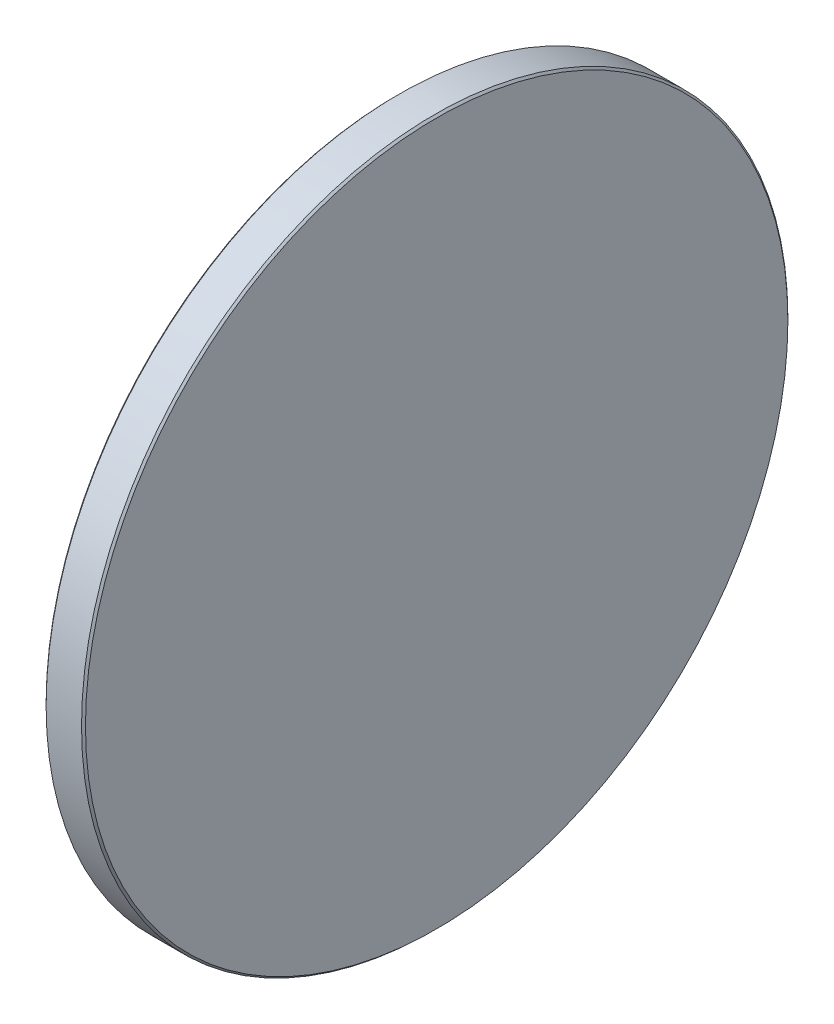
ISO-10303-21;
HEADER;
FILE_DESCRIPTION(('STEP AP214'),'2;1');
FILE_NAME('part.step','',(''),(''),'','','');
FILE_SCHEMA(('AUTOMOTIVE_DESIGN { 1 0 10303 214 1 1 1 1 }'));
ENDSEC;
DATA;
#1=APPLICATION_CONTEXT('core data for automotive mechanical design processes');
#2=APPLICATION_PROTOCOL_DEFINITION('international standard','automotive_design',2000,#1);
#3=PRODUCT_CONTEXT('',#1,'mechanical');
#4=PRODUCT('Part','Part','',(#3));
#5=PRODUCT_RELATED_PRODUCT_CATEGORY('part','',(#4));
#6=PRODUCT_DEFINITION_FORMATION('','',#4);
#7=PRODUCT_DEFINITION_CONTEXT('part definition',#1,'design');
#8=PRODUCT_DEFINITION('design','',#6,#7);
#9=PRODUCT_DEFINITION_SHAPE('','',#8);
#10=(LENGTH_UNIT() NAMED_UNIT(*) SI_UNIT(.MILLI.,.METRE.));
#11=(NAMED_UNIT(*) PLANE_ANGLE_UNIT() SI_UNIT($,.RADIAN.));
#12=(NAMED_UNIT(*) SI_UNIT($,.STERADIAN.) SOLID_ANGLE_UNIT());
#13=UNCERTAINTY_MEASURE_WITH_UNIT(LENGTH_MEASURE(1.E-05),#10,'distance_accuracy_value','');
#14=(GEOMETRIC_REPRESENTATION_CONTEXT(3) GLOBAL_UNCERTAINTY_ASSIGNED_CONTEXT((#13)) GLOBAL_UNIT_ASSIGNED_CONTEXT((#10,
#11,#12)) REPRESENTATION_CONTEXT('',''));
#15=CARTESIAN_POINT('',(0.,0.,0.));
#16=DIRECTION('',(0.,0.,1.));
#17=DIRECTION('',(1.,0.,0.));
#18=AXIS2_PLACEMENT_3D('',#15,#16,#17);
#19=CARTESIAN_POINT('',(-1.415,0.,0.));
#20=DIRECTION('',(1.,0.,0.));
#21=DIRECTION('',(0.,0.,-1.));
#22=AXIS2_PLACEMENT_3D('',#19,#20,#21);
#23=PLANE('',#22);
#24=CARTESIAN_POINT('',(-1.415,0.,0.));
#25=DIRECTION('',(-1.,0.,0.));
#26=DIRECTION('',(0.,0.,1.));
#27=AXIS2_PLACEMENT_3D('',#24,#25,#26);
#28=CIRCLE('',#27,25.2585786437627);
#29=CARTESIAN_POINT('',(-1.415,0.,25.2585786437627));
#30=VERTEX_POINT('',#29);
#31=EDGE_CURVE('E9',#30,#30,#28,.T.);
#32=ORIENTED_EDGE('',*,*,#31,.T.);
#33=EDGE_LOOP('',(#32));
#34=FACE_BOUND('',#33,.T.);
#35=ADVANCED_FACE('F13',(#34),#23,.F.);
#36=CARTESIAN_POINT('',(-1.27357864376269,0.,0.));
#37=DIRECTION('',(1.,0.,0.));
#38=DIRECTION('',(0.,0.,-1.));
#39=AXIS2_PLACEMENT_3D('',#36,#37,#38);
#40=CONICAL_SURFACE('',#39,25.4,0.785398163397451);
#41=ORIENTED_EDGE('',*,*,#31,.F.);
#42=EDGE_LOOP('',(#41));
#43=FACE_BOUND('',#42,.T.);
#44=CARTESIAN_POINT('',(-1.27357864376269,0.,0.));
#45=DIRECTION('',(-1.,0.,0.));
#46=DIRECTION('',(0.,0.,1.));
#47=AXIS2_PLACEMENT_3D('',#44,#45,#46);
#48=CIRCLE('',#47,25.4);
#49=CARTESIAN_POINT('',(-1.27357864376269,0.,25.4));
#50=VERTEX_POINT('',#49);
#51=EDGE_CURVE('E19',#50,#50,#48,.T.);
#52=ORIENTED_EDGE('',*,*,#51,.T.);
#53=EDGE_LOOP('',(#52));
#54=FACE_BOUND('',#53,.T.);
#55=ADVANCED_FACE('F46',(#43,#54),#40,.T.);
#56=CARTESIAN_POINT('',(-1.415,0.,0.));
#57=DIRECTION('',(-1.,0.,0.));
#58=DIRECTION('',(0.,0.,1.));
#59=AXIS2_PLACEMENT_3D('',#56,#57,#58);
#60=CYLINDRICAL_SURFACE('',#59,25.4);
#61=ORIENTED_EDGE('',*,*,#51,.F.);
#62=EDGE_LOOP('',(#61));
#63=FACE_BOUND('',#62,.T.);
#64=CARTESIAN_POINT('',(1.27357864376269,0.,0.));
#65=DIRECTION('',(-1.,0.,0.));
#66=DIRECTION('',(0.,0.,1.));
#67=AXIS2_PLACEMENT_3D('',#64,#65,#66);
#68=CIRCLE('',#67,25.4);
#69=CARTESIAN_POINT('',(1.27357864376269,0.,25.4));
#70=VERTEX_POINT('',#69);
#71=EDGE_CURVE('E23',#70,#70,#68,.T.);
#72=ORIENTED_EDGE('',*,*,#71,.T.);
#73=EDGE_LOOP('',(#72));
#74=FACE_BOUND('',#73,.T.);
#75=ADVANCED_FACE('F42',(#63,#74),#60,.T.);
#76=CARTESIAN_POINT('',(1.415,0.,0.));
#77=DIRECTION('',(-1.,0.,0.));
#78=DIRECTION('',(0.,0.,1.));
#79=AXIS2_PLACEMENT_3D('',#76,#77,#78);
#80=CONICAL_SURFACE('',#79,25.2585786437627,0.78539816339745);
#81=ORIENTED_EDGE('',*,*,#71,.F.);
#82=EDGE_LOOP('',(#81));
#83=FACE_BOUND('',#82,.T.);
#84=CARTESIAN_POINT('',(1.415,0.,0.));
#85=DIRECTION('',(-1.,0.,0.));
#86=DIRECTION('',(0.,0.,1.));
#87=AXIS2_PLACEMENT_3D('',#84,#85,#86);
#88=CIRCLE('',#87,25.2585786437627);
#89=CARTESIAN_POINT('',(1.415,0.,25.2585786437627));
#90=VERTEX_POINT('',#89);
#91=EDGE_CURVE('E27',#90,#90,#88,.T.);
#92=ORIENTED_EDGE('',*,*,#91,.T.);
#93=EDGE_LOOP('',(#92));
#94=FACE_BOUND('',#93,.T.);
#95=ADVANCED_FACE('F33',(#83,#94),#80,.T.);
#96=CARTESIAN_POINT('',(1.415,0.,0.));
#97=DIRECTION('',(-1.,0.,0.));
#98=DIRECTION('',(0.,0.,1.));
#99=AXIS2_PLACEMENT_3D('',#96,#97,#98);
#100=PLANE('',#99);
#101=ORIENTED_EDGE('',*,*,#91,.F.);
#102=EDGE_LOOP('',(#101));
#103=FACE_BOUND('',#102,.T.);
#104=ADVANCED_FACE('F35',(#103),#100,.F.);
#105=CLOSED_SHELL('',(#35,#55,#75,#95,#104));
#106=MANIFOLD_SOLID_BREP('B1',#105);
#107=ADVANCED_BREP_SHAPE_REPRESENTATION('',(#18,#106),#14);
#108=SHAPE_DEFINITION_REPRESENTATION(#9,#107);
ENDSEC;
END-ISO-10303-21;
